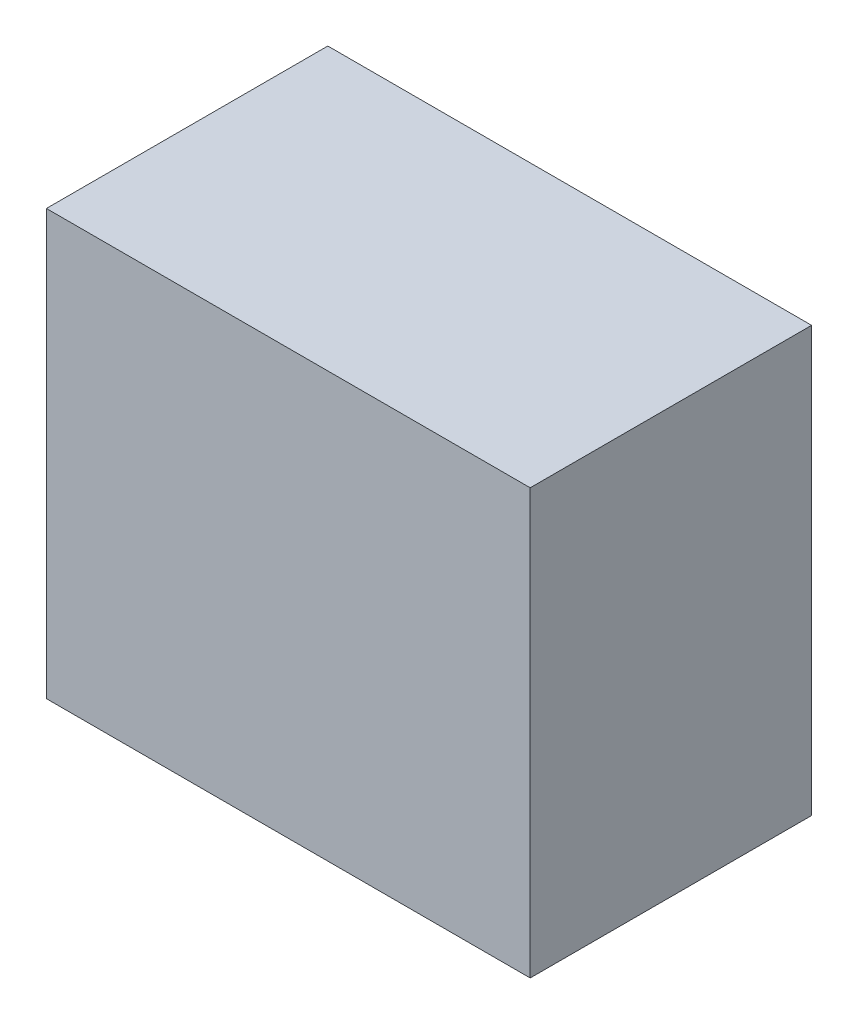
ISO-10303-21;
HEADER;
FILE_DESCRIPTION(('STEP AP214'),'2;1');
FILE_NAME('part.step','',(''),(''),'','','');
FILE_SCHEMA(('AUTOMOTIVE_DESIGN { 1 0 10303 214 1 1 1 1 }'));
ENDSEC;
DATA;
#1=APPLICATION_CONTEXT('core data for automotive mechanical design processes');
#2=APPLICATION_PROTOCOL_DEFINITION('international standard','automotive_design',2000,#1);
#3=PRODUCT_CONTEXT('',#1,'mechanical');
#4=PRODUCT('Part','Part','',(#3));
#5=PRODUCT_RELATED_PRODUCT_CATEGORY('part','',(#4));
#6=PRODUCT_DEFINITION_FORMATION('','',#4);
#7=PRODUCT_DEFINITION_CONTEXT('part definition',#1,'design');
#8=PRODUCT_DEFINITION('design','',#6,#7);
#9=PRODUCT_DEFINITION_SHAPE('','',#8);
#10=(LENGTH_UNIT() NAMED_UNIT(*) SI_UNIT(.MILLI.,.METRE.));
#11=(NAMED_UNIT(*) PLANE_ANGLE_UNIT() SI_UNIT($,.RADIAN.));
#12=(NAMED_UNIT(*) SI_UNIT($,.STERADIAN.) SOLID_ANGLE_UNIT());
#13=UNCERTAINTY_MEASURE_WITH_UNIT(LENGTH_MEASURE(1.E-05),#10,'distance_accuracy_value','');
#14=(GEOMETRIC_REPRESENTATION_CONTEXT(3) GLOBAL_UNCERTAINTY_ASSIGNED_CONTEXT((#13)) GLOBAL_UNIT_ASSIGNED_CONTEXT((#10,
#11,#12)) REPRESENTATION_CONTEXT('',''));
#15=CARTESIAN_POINT('',(0.,0.,0.));
#16=DIRECTION('',(0.,0.,1.));
#17=DIRECTION('',(1.,0.,0.));
#18=AXIS2_PLACEMENT_3D('',#15,#16,#17);
#19=CARTESIAN_POINT('',(-49.,43.,28.5));
#20=DIRECTION('',(1.,0.,0.));
#21=DIRECTION('',(0.,0.,-1.));
#22=AXIS2_PLACEMENT_3D('',#19,#20,#21);
#23=PLANE('',#22);
#24=DIRECTION('',(0.,0.,1.));
#25=VECTOR('',#24,1.);
#26=CARTESIAN_POINT('',(-49.,-43.,28.5));
#27=LINE('',#26,#25);
#28=CARTESIAN_POINT('',(-49.,-43.,-28.5));
#29=VERTEX_POINT('',#28);
#30=CARTESIAN_POINT('',(-49.,-43.,28.5));
#31=VERTEX_POINT('',#30);
#32=EDGE_CURVE('E95',#29,#31,#27,.T.);
#33=ORIENTED_EDGE('',*,*,#32,.T.);
#34=DIRECTION('',(0.,-1.,0.));
#35=VECTOR('',#34,1.);
#36=CARTESIAN_POINT('',(-49.,43.,28.5));
#37=LINE('',#36,#35);
#38=CARTESIAN_POINT('',(-49.,43.,28.5));
#39=VERTEX_POINT('',#38);
#40=EDGE_CURVE('E11',#39,#31,#37,.T.);
#41=ORIENTED_EDGE('',*,*,#40,.F.);
#42=DIRECTION('',(0.,0.,1.));
#43=VECTOR('',#42,1.);
#44=CARTESIAN_POINT('',(-49.,43.,28.5));
#45=LINE('',#44,#43);
#46=CARTESIAN_POINT('',(-49.,43.,-28.5));
#47=VERTEX_POINT('',#46);
#48=EDGE_CURVE('E83',#47,#39,#45,.T.);
#49=ORIENTED_EDGE('',*,*,#48,.F.);
#50=DIRECTION('',(0.,-1.,0.));
#51=VECTOR('',#50,1.);
#52=CARTESIAN_POINT('',(-49.,43.,-28.5));
#53=LINE('',#52,#51);
#54=EDGE_CURVE('E91',#47,#29,#53,.T.);
#55=ORIENTED_EDGE('',*,*,#54,.T.);
#56=EDGE_LOOP('',(#33,#41,#49,#55));
#57=FACE_BOUND('',#56,.T.);
#58=ADVANCED_FACE('F32',(#57),#23,.F.);
#59=CARTESIAN_POINT('',(49.,43.,28.5));
#60=DIRECTION('',(0.,0.,-1.));
#61=DIRECTION('',(-1.,0.,0.));
#62=AXIS2_PLACEMENT_3D('',#59,#60,#61);
#63=PLANE('',#62);
#64=DIRECTION('',(1.,0.,0.));
#65=VECTOR('',#64,1.);
#66=CARTESIAN_POINT('',(49.,-43.,28.5));
#67=LINE('',#66,#65);
#68=CARTESIAN_POINT('',(49.,-43.,28.5));
#69=VERTEX_POINT('',#68);
#70=EDGE_CURVE('E87',#31,#69,#67,.T.);
#71=ORIENTED_EDGE('',*,*,#70,.T.);
#72=DIRECTION('',(0.,-1.,0.));
#73=VECTOR('',#72,1.);
#74=CARTESIAN_POINT('',(49.,43.,28.5));
#75=LINE('',#74,#73);
#76=CARTESIAN_POINT('',(49.,43.,28.5));
#77=VERTEX_POINT('',#76);
#78=EDGE_CURVE('E40',#77,#69,#75,.T.);
#79=ORIENTED_EDGE('',*,*,#78,.F.);
#80=DIRECTION('',(1.,0.,0.));
#81=VECTOR('',#80,1.);
#82=CARTESIAN_POINT('',(49.,43.,28.5));
#83=LINE('',#82,#81);
#84=EDGE_CURVE('E78',#39,#77,#83,.T.);
#85=ORIENTED_EDGE('',*,*,#84,.F.);
#86=ORIENTED_EDGE('',*,*,#40,.T.);
#87=EDGE_LOOP('',(#71,#79,#85,#86));
#88=FACE_BOUND('',#87,.T.);
#89=ADVANCED_FACE('F86',(#88),#63,.F.);
#90=CARTESIAN_POINT('',(49.,43.,28.5));
#91=DIRECTION('',(-1.,0.,0.));
#92=DIRECTION('',(0.,0.,1.));
#93=AXIS2_PLACEMENT_3D('',#90,#91,#92);
#94=PLANE('',#93);
#95=DIRECTION('',(0.,0.,-1.));
#96=VECTOR('',#95,1.);
#97=CARTESIAN_POINT('',(49.,-43.,28.5));
#98=LINE('',#97,#96);
#99=CARTESIAN_POINT('',(49.,-43.,-28.5));
#100=VERTEX_POINT('',#99);
#101=EDGE_CURVE('E65',#69,#100,#98,.T.);
#102=ORIENTED_EDGE('',*,*,#101,.T.);
#103=DIRECTION('',(0.,-1.,0.));
#104=VECTOR('',#103,1.);
#105=CARTESIAN_POINT('',(49.,43.,-28.5));
#106=LINE('',#105,#104);
#107=CARTESIAN_POINT('',(49.,43.,-28.5));
#108=VERTEX_POINT('',#107);
#109=EDGE_CURVE('E88',#108,#100,#106,.T.);
#110=ORIENTED_EDGE('',*,*,#109,.F.);
#111=DIRECTION('',(0.,0.,-1.));
#112=VECTOR('',#111,1.);
#113=CARTESIAN_POINT('',(49.,43.,28.5));
#114=LINE('',#113,#112);
#115=EDGE_CURVE('E81',#77,#108,#114,.T.);
#116=ORIENTED_EDGE('',*,*,#115,.F.);
#117=ORIENTED_EDGE('',*,*,#78,.T.);
#118=EDGE_LOOP('',(#102,#110,#116,#117));
#119=FACE_BOUND('',#118,.T.);
#120=ADVANCED_FACE('F89',(#119),#94,.F.);
#121=CARTESIAN_POINT('',(49.,43.,-28.5));
#122=DIRECTION('',(0.,0.,1.));
#123=DIRECTION('',(1.,0.,0.));
#124=AXIS2_PLACEMENT_3D('',#121,#122,#123);
#125=PLANE('',#124);
#126=DIRECTION('',(-1.,0.,0.));
#127=VECTOR('',#126,1.);
#128=CARTESIAN_POINT('',(49.,-43.,-28.5));
#129=LINE('',#128,#127);
#130=EDGE_CURVE('E71',#100,#29,#129,.T.);
#131=ORIENTED_EDGE('',*,*,#130,.T.);
#132=ORIENTED_EDGE('',*,*,#54,.F.);
#133=DIRECTION('',(-1.,0.,0.));
#134=VECTOR('',#133,1.);
#135=CARTESIAN_POINT('',(49.,43.,-28.5));
#136=LINE('',#135,#134);
#137=EDGE_CURVE('E48',#108,#47,#136,.T.);
#138=ORIENTED_EDGE('',*,*,#137,.F.);
#139=ORIENTED_EDGE('',*,*,#109,.T.);
#140=EDGE_LOOP('',(#131,#132,#138,#139));
#141=FACE_BOUND('',#140,.T.);
#142=ADVANCED_FACE('F102',(#141),#125,.F.);
#143=CARTESIAN_POINT('',(0.,43.,0.));
#144=DIRECTION('',(0.,1.,0.));
#145=DIRECTION('',(0.,0.,1.));
#146=AXIS2_PLACEMENT_3D('',#143,#144,#145);
#147=PLANE('',#146);
#148=ORIENTED_EDGE('',*,*,#48,.T.);
#149=ORIENTED_EDGE('',*,*,#84,.T.);
#150=ORIENTED_EDGE('',*,*,#115,.T.);
#151=ORIENTED_EDGE('',*,*,#137,.T.);
#152=EDGE_LOOP('',(#148,#149,#150,#151));
#153=FACE_BOUND('',#152,.T.);
#154=ADVANCED_FACE('F79',(#153),#147,.T.);
#155=CARTESIAN_POINT('',(0.,-43.,0.));
#156=DIRECTION('',(0.,1.,0.));
#157=DIRECTION('',(0.,0.,1.));
#158=AXIS2_PLACEMENT_3D('',#155,#156,#157);
#159=PLANE('',#158);
#160=ORIENTED_EDGE('',*,*,#32,.F.);
#161=ORIENTED_EDGE('',*,*,#130,.F.);
#162=ORIENTED_EDGE('',*,*,#101,.F.);
#163=ORIENTED_EDGE('',*,*,#70,.F.);
#164=EDGE_LOOP('',(#160,#161,#162,#163));
#165=FACE_BOUND('',#164,.T.);
#166=ADVANCED_FACE('F105',(#165),#159,.F.);
#167=CLOSED_SHELL('',(#58,#89,#120,#142,#154,#166));
#168=MANIFOLD_SOLID_BREP('B2',#167);
#169=ADVANCED_BREP_SHAPE_REPRESENTATION('',(#18,#168),#14);
#170=SHAPE_DEFINITION_REPRESENTATION(#9,#169);
ENDSEC;
END-ISO-10303-21;
